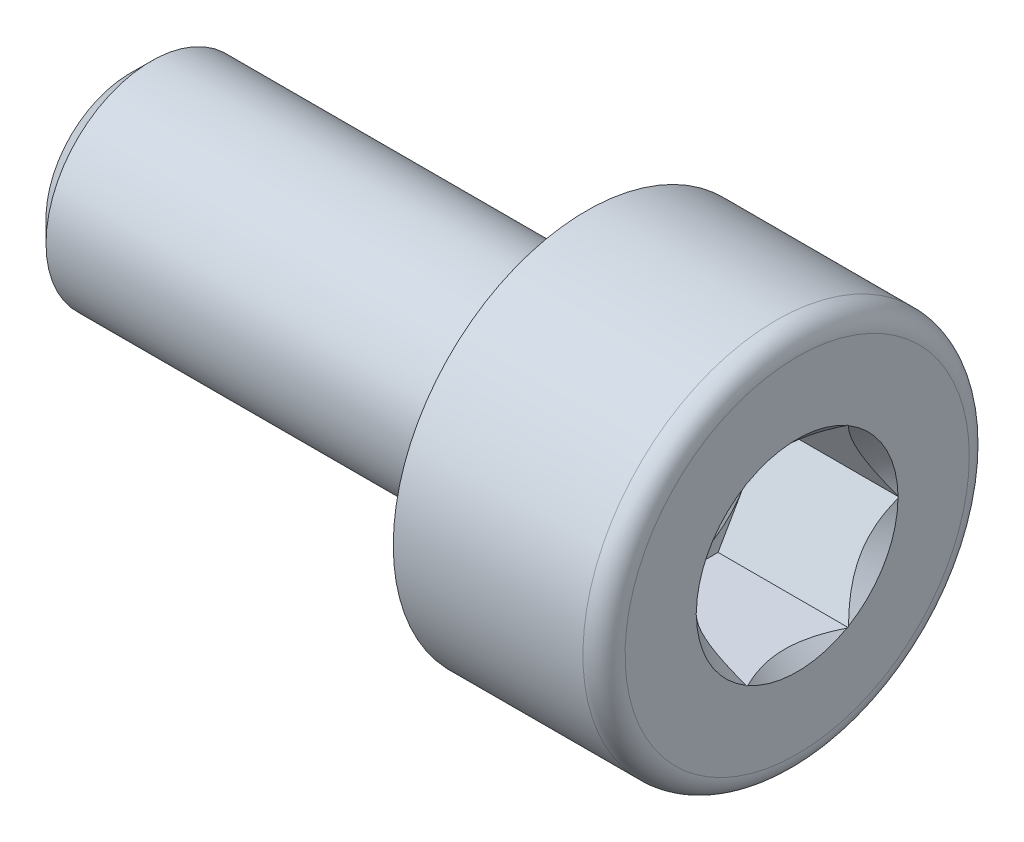
ISO-10303-21;
HEADER;
FILE_DESCRIPTION(('STEP AP214'),'2;1');
FILE_NAME('part.step','',(''),(''),'','','');
FILE_SCHEMA(('AUTOMOTIVE_DESIGN { 1 0 10303 214 1 1 1 1 }'));
ENDSEC;
DATA;
#1=APPLICATION_CONTEXT('core data for automotive mechanical design processes');
#2=APPLICATION_PROTOCOL_DEFINITION('international standard','automotive_design',2000,#1);
#3=PRODUCT_CONTEXT('',#1,'mechanical');
#4=PRODUCT('Part','Part','',(#3));
#5=PRODUCT_RELATED_PRODUCT_CATEGORY('part','',(#4));
#6=PRODUCT_DEFINITION_FORMATION('','',#4);
#7=PRODUCT_DEFINITION_CONTEXT('part definition',#1,'design');
#8=PRODUCT_DEFINITION('design','',#6,#7);
#9=PRODUCT_DEFINITION_SHAPE('','',#8);
#10=(LENGTH_UNIT() NAMED_UNIT(*) SI_UNIT(.MILLI.,.METRE.));
#11=(NAMED_UNIT(*) PLANE_ANGLE_UNIT() SI_UNIT($,.RADIAN.));
#12=(NAMED_UNIT(*) SI_UNIT($,.STERADIAN.) SOLID_ANGLE_UNIT());
#13=UNCERTAINTY_MEASURE_WITH_UNIT(LENGTH_MEASURE(1.E-05),#10,'distance_accuracy_value','');
#14=(GEOMETRIC_REPRESENTATION_CONTEXT(3) GLOBAL_UNCERTAINTY_ASSIGNED_CONTEXT((#13)) GLOBAL_UNIT_ASSIGNED_CONTEXT((#10,
#11,#12)) REPRESENTATION_CONTEXT('',''));
#15=CARTESIAN_POINT('',(0.,0.,0.));
#16=DIRECTION('',(0.,0.,1.));
#17=DIRECTION('',(1.,0.,0.));
#18=AXIS2_PLACEMENT_3D('',#15,#16,#17);
#19=CARTESIAN_POINT('',(12.3555753520445,407.524390512293,-362.357299098567));
#20=DIRECTION('',(-1.,0.,0.));
#21=DIRECTION('',(0.,0.,1.));
#22=AXIS2_PLACEMENT_3D('',#19,#20,#21);
#23=PLANE('',#22);
#24=DIRECTION('',(0.,0.001436357737234,-0.999998968437693));
#25=VECTOR('',#24,1.);
#26=CARTESIAN_POINT('',(12.3555753520447,406.275428403654,-363.08078163776));
#27=LINE('',#26,#25);
#28=CARTESIAN_POINT('',(12.3555753524192,406.274391801977,-362.359094545738));
#29=VERTEX_POINT('',#28);
#30=CARTESIAN_POINT('',(12.3555753520447,406.275428403654,-363.08078163776));
#31=VERTEX_POINT('',#30);
#32=EDGE_CURVE('E162',#29,#31,#27,.T.);
#33=ORIENTED_EDGE('',*,*,#32,.T.);
#34=DIRECTION('',(0.,0.866742689293892,-0.49875556192948));
#35=VECTOR('',#34,1.);
#36=CARTESIAN_POINT('',(12.3555753520447,407.526463716109,-363.800673282609));
#37=LINE('',#36,#35);
#38=CARTESIAN_POINT('',(12.3555753524191,406.900946059996,-363.440727459984));
#39=VERTEX_POINT('',#38);
#40=EDGE_CURVE('E158',#31,#39,#37,.T.);
#41=ORIENTED_EDGE('',*,*,#40,.T.);
#42=CARTESIAN_POINT('',(12.3555753527938,407.524390512293,-362.357299098567));
#43=DIRECTION('',(1.,0.,-2.1648728653482E-13));
#44=DIRECTION('',(-2.1648728653482E-13,0.,-1.));
#45=AXIS2_PLACEMENT_3D('',#42,#43,#44);
#46=CIRCLE('',#45,1.24999999953734);
#47=EDGE_CURVE('E159',#39,#29,#46,.F.);
#48=ORIENTED_EDGE('',*,*,#47,.T.);
#49=EDGE_LOOP('',(#33,#41,#48));
#50=FACE_BOUND('',#49,.T.);
#51=ADVANCED_FACE('F17',(#50),#23,.F.);
#52=CARTESIAN_POINT('',(12.3555753520445,407.524390512293,-362.357299098567));
#53=DIRECTION('',(-1.,0.,0.));
#54=DIRECTION('',(0.,0.,1.));
#55=AXIS2_PLACEMENT_3D('',#52,#53,#54);
#56=PLANE('',#55);
#57=DIRECTION('',(0.,-0.865306331556659,-0.501243406508213));
#58=VECTOR('',#57,1.);
#59=CARTESIAN_POINT('',(12.3555753520446,406.273355199838,-361.637407453717));
#60=LINE('',#59,#58);
#61=CARTESIAN_POINT('',(12.3555753524193,406.897836254274,-361.275666184321));
#62=VERTEX_POINT('',#61);
#63=CARTESIAN_POINT('',(12.3555753520446,406.273355199838,-361.637407453717));
#64=VERTEX_POINT('',#63);
#65=EDGE_CURVE('E526',#62,#64,#60,.T.);
#66=ORIENTED_EDGE('',*,*,#65,.T.);
#67=DIRECTION('',(0.,0.001436357737234,-0.999998968437693));
#68=VECTOR('',#67,1.);
#69=CARTESIAN_POINT('',(12.3555753520446,406.275428403654,-363.08078163776));
#70=LINE('',#69,#68);
#71=EDGE_CURVE('E554',#64,#29,#70,.T.);
#72=ORIENTED_EDGE('',*,*,#71,.T.);
#73=CARTESIAN_POINT('',(12.3555753527938,407.524390512293,-362.357299098567));
#74=DIRECTION('',(1.,0.,-2.1648728653482E-13));
#75=DIRECTION('',(-2.1648728653482E-13,0.,-1.));
#76=AXIS2_PLACEMENT_3D('',#73,#74,#75);
#77=CIRCLE('',#76,1.2499999995374);
#78=EDGE_CURVE('E177',#62,#29,#77,.T.);
#79=ORIENTED_EDGE('',*,*,#78,.F.);
#80=EDGE_LOOP('',(#66,#72,#79));
#81=FACE_BOUND('',#80,.T.);
#82=ADVANCED_FACE('F752',(#81),#56,.F.);
#83=CARTESIAN_POINT('',(12.3555753520447,406.275428403654,-363.08078163776));
#84=DIRECTION('',(0.,-0.999998968437693,-0.001436357737234));
#85=DIRECTION('',(0.,0.001436357737234,-0.999998968437693));
#86=AXIS2_PLACEMENT_3D('',#83,#84,#85);
#87=PLANE('',#86);
#88=DIRECTION('',(0.,0.001436357737234,-0.999998968437693));
#89=VECTOR('',#88,1.);
#90=CARTESIAN_POINT('',(14.2055753520446,406.275428403654,-363.08078163776));
#91=LINE('',#90,#89);
#92=CARTESIAN_POINT('',(14.2055753520446,406.275428403654,-363.08078163776));
#93=VERTEX_POINT('',#92);
#94=CARTESIAN_POINT('',(14.2055753520973,406.275404128297,-363.063881020518));
#95=VERTEX_POINT('',#94);
#96=EDGE_CURVE('E426',#93,#95,#91,.F.);
#97=ORIENTED_EDGE('',*,*,#96,.F.);
#98=DIRECTION('',(1.,0.,0.));
#99=VECTOR('',#98,1.);
#100=CARTESIAN_POINT('',(12.3555753520447,406.275428403654,-363.08078163776));
#101=LINE('',#100,#99);
#102=EDGE_CURVE('E167',#93,#31,#101,.F.);
#103=ORIENTED_EDGE('',*,*,#102,.T.);
#104=ORIENTED_EDGE('',*,*,#32,.F.);
#105=ORIENTED_EDGE('',*,*,#71,.F.);
#106=DIRECTION('',(1.,0.,0.));
#107=VECTOR('',#106,1.);
#108=CARTESIAN_POINT('',(12.3555753520446,406.273355199838,-361.637407453717));
#109=LINE('',#108,#107);
#110=CARTESIAN_POINT('',(14.2055753520446,406.273355199838,-361.637407453717));
#111=VERTEX_POINT('',#110);
#112=EDGE_CURVE('E516',#64,#111,#109,.T.);
#113=ORIENTED_EDGE('',*,*,#112,.T.);
#114=DIRECTION('',(0.,0.001436357737234,-0.999998968437693));
#115=VECTOR('',#114,1.);
#116=CARTESIAN_POINT('',(14.2055753520445,406.275428403654,-363.08078163776));
#117=LINE('',#116,#115);
#118=CARTESIAN_POINT('',(14.2055753521435,406.273379475196,-361.654308070866));
#119=VERTEX_POINT('',#118);
#120=EDGE_CURVE('E180',#119,#111,#117,.F.);
#121=ORIENTED_EDGE('',*,*,#120,.F.);
#122=CARTESIAN_POINT('',(14.2055753521289,406.275404128279,-363.063881020602));
#123=CARTESIAN_POINT('',(14.1818605667848,406.27533471834,-363.01555748896));
#124=CARTESIAN_POINT('',(14.159569883742,406.275264168751,-362.966440531812));
#125=CARTESIAN_POINT('',(14.1187835332008,406.275120364132,-362.866323081653));
#126=CARTESIAN_POINT('',(14.100311583221,406.275047095343,-362.815313009532));
#127=CARTESIAN_POINT('',(14.0684823412007,406.274898546402,-362.711892543476));
#128=CARTESIAN_POINT('',(14.0551059144007,406.274823274934,-362.659488195058));
#129=CARTESIAN_POINT('',(14.0345556307389,406.274671155289,-362.553581787525));
#130=CARTESIAN_POINT('',(14.027363591714,406.27459431242,-362.500083422933));
#131=CARTESIAN_POINT('',(14.0226061400704,406.274496306429,-362.431851194154));
#132=CARTESIAN_POINT('',(14.0218454535466,406.27447541587,-362.417307089476));
#133=CARTESIAN_POINT('',(14.0208299372629,406.274433618425,-362.388207513194));
#134=CARTESIAN_POINT('',(14.0205748780474,406.274412711551,-362.373652049746));
#135=CARTESIAN_POINT('',(14.0205765865692,406.274337309511,-362.321156797229));
#136=CARTESIAN_POINT('',(14.022313287963,406.274282797371,-362.283205190141));
#137=CARTESIAN_POINT('',(14.029156995847,406.274174198452,-362.207598115691));
#138=CARTESIAN_POINT('',(14.0342663783373,406.274120112002,-362.169942876053));
#139=CARTESIAN_POINT('',(14.0543308196241,406.273958596293,-362.057494884655));
#140=CARTESIAN_POINT('',(14.0740189447633,406.273852342445,-361.983520459123));
#141=CARTESIAN_POINT('',(14.1132845540875,406.273685025343,-361.867033510921));
#142=CARTESIAN_POINT('',(14.129937513991,406.273622432678,-361.823456205249));
#143=CARTESIAN_POINT('',(14.1659144313925,406.273499472257,-361.737850585708));
#144=CARTESIAN_POINT('',(14.185214236532,406.273439090016,-361.695812186982));
#145=CARTESIAN_POINT('',(14.2055753521374,406.273379475196,-361.654308070878));
#146=B_SPLINE_CURVE_WITH_KNOTS('',3,(#122,#123,#124,#125,#126,#127,#128,#129,#130,#131,#132,
#133,#134,#135,#136,#137,#138,#139,#140,#141,#142,#143,#144,#145),.UNSPECIFIED.,.F.,.F.,(4,2,2,
2,2,2,2,2,2,2,2,4),(0.,0.161592976200705,0.324161275185263,0.486112932506154,0.64758680624857,
0.691272786581087,0.734938937498539,0.848735605594725,0.962612527312217,1.1912562519349,
1.33113310613993,1.46980937849091),.UNSPECIFIED.);
#147=EDGE_CURVE('E421',#95,#119,#146,.T.);
#148=ORIENTED_EDGE('',*,*,#147,.F.);
#149=EDGE_LOOP('',(#97,#103,#104,#105,#113,#121,#148));
#150=FACE_BOUND('',#149,.T.);
#151=ADVANCED_FACE('F412',(#150),#87,.F.);
#152=CARTESIAN_POINT('',(12.3555753520447,407.526463716109,-363.800673282609));
#153=DIRECTION('',(0.,-0.49875556192948,-0.866742689293892));
#154=DIRECTION('',(0.,0.866742689293892,-0.49875556192948));
#155=AXIS2_PLACEMENT_3D('',#152,#153,#154);
#156=PLANE('',#155);
#157=DIRECTION('',(1.,0.,0.));
#158=VECTOR('',#157,1.);
#159=CARTESIAN_POINT('',(12.3555753520446,407.526463716109,-363.800673282609));
#160=LINE('',#159,#158);
#161=CARTESIAN_POINT('',(14.2055753520446,407.526463716109,-363.800673282609));
#162=VERTEX_POINT('',#161);
#163=CARTESIAN_POINT('',(12.3555753520446,407.526463716109,-363.800673282609));
#164=VERTEX_POINT('',#163);
#165=EDGE_CURVE('E172',#162,#164,#160,.F.);
#166=ORIENTED_EDGE('',*,*,#165,.T.);
#167=DIRECTION('',(0.,-0.866742689293953,0.498755561929374));
#168=VECTOR('',#167,1.);
#169=CARTESIAN_POINT('',(12.3555753520445,407.526463716109,-363.800673282609));
#170=LINE('',#169,#168);
#171=EDGE_CURVE('E146',#164,#39,#170,.T.);
#172=ORIENTED_EDGE('',*,*,#171,.T.);
#173=ORIENTED_EDGE('',*,*,#40,.F.);
#174=ORIENTED_EDGE('',*,*,#102,.F.);
#175=DIRECTION('',(0.,0.866742689293892,-0.49875556192948));
#176=VECTOR('',#175,1.);
#177=CARTESIAN_POINT('',(14.2055753520446,407.526463716109,-363.800673282609));
#178=LINE('',#177,#176);
#179=CARTESIAN_POINT('',(14.2055753521434,406.290076905122,-363.089210923257));
#180=VERTEX_POINT('',#179);
#181=EDGE_CURVE('E420',#180,#93,#178,.F.);
#182=ORIENTED_EDGE('',*,*,#181,.F.);
#183=CARTESIAN_POINT('',(14.2055753521287,407.511815214623,-363.792243997122));
#184=CARTESIAN_POINT('',(14.1818605667839,407.46993110365,-363.76814234207));
#185=CARTESIAN_POINT('',(14.1595698837407,407.427359296207,-363.743644961233));
#186=CARTESIAN_POINT('',(14.1187835331992,407.340583138697,-363.693710774605));
#187=CARTESIAN_POINT('',(14.1003115832193,407.296370485996,-363.668269191176));
#188=CARTESIAN_POINT('',(14.0684823411992,407.20673146065,-363.616687605306));
#189=CARTESIAN_POINT('',(14.0551059143994,407.161310327918,-363.590550618102));
#190=CARTESIAN_POINT('',(14.0345556307389,407.069516628751,-363.537729153811));
#191=CARTESIAN_POINT('',(14.0273635917152,407.023147264521,-363.51104651939));
#192=CARTESIAN_POINT('',(14.0226061400698,406.964007418044,-363.477015280683));
#193=CARTESIAN_POINT('',(14.0218454535455,406.951401408638,-363.469761320099));
#194=CARTESIAN_POINT('',(14.0208299372636,406.926179537618,-363.455247729603));
#195=CARTESIAN_POINT('',(14.0205748780505,406.913563683074,-363.447988103759));
#196=CARTESIAN_POINT('',(14.0205765865764,406.8680637598,-363.421805777573));
#197=CARTESIAN_POINT('',(14.0223132879649,406.835169447871,-363.402877182939));
#198=CARTESIAN_POINT('',(14.0291569958448,406.769637501227,-363.365167695145));
#199=CARTESIAN_POINT('',(14.0342663783365,406.737000063892,-363.346386915563));
#200=CARTESIAN_POINT('',(14.0543308196254,406.639536488885,-363.290302796567));
#201=CARTESIAN_POINT('',(14.0740189447635,406.575419630219,-363.253407602335));
#202=CARTESIAN_POINT('',(14.113284554087,406.474455315315,-363.195309029096));
#203=CARTESIAN_POINT('',(14.1299375139905,406.436684965243,-363.173574583098));
#204=CARTESIAN_POINT('',(14.1659144313923,406.362486843802,-363.130878260175));
#205=CARTESIAN_POINT('',(14.1852142365321,406.32605033145,-363.109911353366));
#206=CARTESIAN_POINT('',(14.2055753521375,406.290076905133,-363.089210923263));
#207=B_SPLINE_CURVE_WITH_KNOTS('',3,(#183,#184,#185,#186,#187,#188,#189,#190,#191,#192,#193,
#194,#195,#196,#197,#198,#199,#200,#201,#202,#203,#204,#205,#206),.UNSPECIFIED.,.F.,.F.,(4,2,2,
2,2,2,2,2,2,2,2,4),(0.,0.161592976203974,0.324161275190541,0.486112932508355,0.647586806248283,
0.691272786580778,0.734938937498177,0.848735605595208,0.962612527312501,1.19125625193406,
1.33113310613897,1.46980937849126),.UNSPECIFIED.);
#208=CARTESIAN_POINT('',(14.2055753520972,407.511815214559,-363.792243997064));
#209=VERTEX_POINT('',#208);
#210=EDGE_CURVE('E415',#209,#180,#207,.T.);
#211=ORIENTED_EDGE('',*,*,#210,.F.);
#212=DIRECTION('',(0.,0.866742689293892,-0.49875556192948));
#213=VECTOR('',#212,1.);
#214=CARTESIAN_POINT('',(14.2055753520445,407.526463716109,-363.800673282609));
#215=LINE('',#214,#213);
#216=EDGE_CURVE('E166',#162,#209,#215,.F.);
#217=ORIENTED_EDGE('',*,*,#216,.F.);
#218=EDGE_LOOP('',(#166,#172,#173,#174,#182,#211,#217));
#219=FACE_BOUND('',#218,.T.);
#220=ADVANCED_FACE('F169',(#219),#156,.F.);
#221=CARTESIAN_POINT('',(12.3555753520445,407.524390512293,-362.357299098567));
#222=DIRECTION('',(-1.,0.,0.));
#223=DIRECTION('',(0.,0.,1.));
#224=AXIS2_PLACEMENT_3D('',#221,#222,#223);
#225=PLANE('',#224);
#226=ORIENTED_EDGE('',*,*,#171,.F.);
#227=DIRECTION('',(0.,0.865306331556659,0.501243406508213));
#228=VECTOR('',#227,1.);
#229=CARTESIAN_POINT('',(12.3555753520447,408.775425824748,-363.077190743417));
#230=LINE('',#229,#228);
#231=CARTESIAN_POINT('',(12.3555753524191,408.150944770312,-363.438932012813));
#232=VERTEX_POINT('',#231);
#233=EDGE_CURVE('E148',#164,#232,#230,.T.);
#234=ORIENTED_EDGE('',*,*,#233,.T.);
#235=CARTESIAN_POINT('',(12.3555753527938,407.524390512293,-362.357299098567));
#236=DIRECTION('',(1.,0.,-2.1648728653482E-13));
#237=DIRECTION('',(-2.1648728653482E-13,0.,-1.));
#238=AXIS2_PLACEMENT_3D('',#235,#236,#237);
#239=CIRCLE('',#238,1.24999999953735);
#240=EDGE_CURVE('E142',#232,#39,#239,.F.);
#241=ORIENTED_EDGE('',*,*,#240,.T.);
#242=EDGE_LOOP('',(#226,#234,#241));
#243=FACE_BOUND('',#242,.T.);
#244=ADVANCED_FACE('F144',(#243),#225,.F.);
#245=CARTESIAN_POINT('',(12.3555753527282,407.524390512293,-362.357299098567));
#246=DIRECTION('',(1.,0.,-2.1648728653482E-13));
#247=DIRECTION('',(-2.1648728653482E-13,0.,-1.));
#248=AXIS2_PLACEMENT_3D('',#245,#246,#247);
#249=CONICAL_SURFACE('',#248,1.24999999942377,1.04719754973717);
#250=CARTESIAN_POINT('',(12.3555753527938,407.524390512293,-362.357299098567));
#251=DIRECTION('',(1.,0.,-2.1648728653482E-13));
#252=DIRECTION('',(-2.1648728653482E-13,0.,-1.));
#253=AXIS2_PLACEMENT_3D('',#250,#251,#252);
#254=CIRCLE('',#253,1.24999999953746);
#255=CARTESIAN_POINT('',(12.3555753524193,408.147834964589,-361.27387073715));
#256=VERTEX_POINT('',#255);
#257=EDGE_CURVE('E153',#256,#62,#254,.T.);
#258=ORIENTED_EDGE('',*,*,#257,.T.);
#259=ORIENTED_EDGE('',*,*,#78,.T.);
#260=ORIENTED_EDGE('',*,*,#47,.F.);
#261=ORIENTED_EDGE('',*,*,#240,.F.);
#262=CARTESIAN_POINT('',(12.3555753527938,407.524390512293,-362.357299098567));
#263=DIRECTION('',(1.,0.,-2.1648728653482E-13));
#264=DIRECTION('',(-2.1648728653482E-13,0.,-1.));
#265=AXIS2_PLACEMENT_3D('',#262,#263,#264);
#266=CIRCLE('',#265,1.2499999995374);
#267=CARTESIAN_POINT('',(12.3555753524192,408.774389222609,-362.355503651395));
#268=VERTEX_POINT('',#267);
#269=EDGE_CURVE('E380',#232,#268,#266,.T.);
#270=ORIENTED_EDGE('',*,*,#269,.T.);
#271=CARTESIAN_POINT('',(12.3555753527938,407.524390512293,-362.357299098567));
#272=DIRECTION('',(1.,0.,-2.1648728653482E-13));
#273=DIRECTION('',(-2.1648728653482E-13,0.,-1.));
#274=AXIS2_PLACEMENT_3D('',#271,#272,#273);
#275=CIRCLE('',#274,1.24999999953748);
#276=EDGE_CURVE('E789',#268,#256,#275,.T.);
#277=ORIENTED_EDGE('',*,*,#276,.T.);
#278=EDGE_LOOP('',(#258,#259,#260,#261,#270,#277));
#279=FACE_BOUND('',#278,.T.);
#280=CARTESIAN_POINT('',(11.633887514364,407.524390512293,-362.357299098624));
#281=VERTEX_POINT('',#280);
#282=VERTEX_LOOP('',#281);
#283=FACE_BOUND('',#282,.T.);
#284=ADVANCED_FACE('F174',(#279,#283),#249,.F.);
#285=CARTESIAN_POINT('',(12.3555753520445,407.524390512293,-362.357299098567));
#286=DIRECTION('',(-1.,0.,0.));
#287=DIRECTION('',(0.,0.,1.));
#288=AXIS2_PLACEMENT_3D('',#285,#286,#287);
#289=PLANE('',#288);
#290=DIRECTION('',(0.,-0.866742689293892,0.49875556192948));
#291=VECTOR('',#290,1.);
#292=CARTESIAN_POINT('',(12.3555753520445,407.522317308477,-360.913924914525));
#293=LINE('',#292,#291);
#294=CARTESIAN_POINT('',(12.3555753520445,407.522317308477,-360.913924914525));
#295=VERTEX_POINT('',#294);
#296=EDGE_CURVE('E511',#256,#295,#293,.T.);
#297=ORIENTED_EDGE('',*,*,#296,.T.);
#298=DIRECTION('',(0.,-0.865306331556659,-0.501243406508213));
#299=VECTOR('',#298,1.);
#300=CARTESIAN_POINT('',(12.3555753520446,406.273355199838,-361.637407453717));
#301=LINE('',#300,#299);
#302=EDGE_CURVE('E521',#295,#62,#301,.T.);
#303=ORIENTED_EDGE('',*,*,#302,.T.);
#304=ORIENTED_EDGE('',*,*,#257,.F.);
#305=EDGE_LOOP('',(#297,#303,#304));
#306=FACE_BOUND('',#305,.T.);
#307=ADVANCED_FACE('F400',(#306),#289,.F.);
#308=CARTESIAN_POINT('',(12.3555753520446,406.273355199838,-361.637407453717));
#309=DIRECTION('',(0.,-0.501243406508213,0.865306331556659));
#310=DIRECTION('',(0.,-0.865306331556659,-0.501243406508213));
#311=AXIS2_PLACEMENT_3D('',#308,#309,#310);
#312=PLANE('',#311);
#313=ORIENTED_EDGE('',*,*,#112,.F.);
#314=ORIENTED_EDGE('',*,*,#65,.F.);
#315=ORIENTED_EDGE('',*,*,#302,.F.);
#316=DIRECTION('',(1.,0.,0.));
#317=VECTOR('',#316,1.);
#318=CARTESIAN_POINT('',(12.3555753520446,407.522317308477,-360.913924914525));
#319=LINE('',#318,#317);
#320=CARTESIAN_POINT('',(14.2055753520446,407.522317308477,-360.913924914525));
#321=VERTEX_POINT('',#320);
#322=EDGE_CURVE('E507',#295,#321,#319,.T.);
#323=ORIENTED_EDGE('',*,*,#322,.T.);
#324=DIRECTION('',(0.,-0.865306331556659,-0.501243406508213));
#325=VECTOR('',#324,1.);
#326=CARTESIAN_POINT('',(14.2055753520446,406.273355199838,-361.637407453717));
#327=LINE('',#326,#325);
#328=CARTESIAN_POINT('',(14.205575352144,407.507693082365,-360.922396246175));
#329=VERTEX_POINT('',#328);
#330=EDGE_CURVE('E519',#329,#321,#327,.F.);
#331=ORIENTED_EDGE('',*,*,#330,.F.);
#332=CARTESIAN_POINT('',(14.2055753521297,406.287979425948,-361.628936122046));
#333=CARTESIAN_POINT('',(14.181860566785,406.329794126983,-361.604714245454));
#334=CARTESIAN_POINT('',(14.1595698837418,406.372295384836,-361.580094669143));
#335=CARTESIAN_POINT('',(14.1187835332003,406.458927737727,-361.52991140561));
#336=CARTESIAN_POINT('',(14.1003115832204,406.50306712164,-361.504342916917));
#337=CARTESIAN_POINT('',(14.0684823412004,406.592557598044,-361.452504036732));
#338=CARTESIAN_POINT('',(14.0551059144005,406.637903459308,-361.426236675519));
#339=CARTESIAN_POINT('',(14.0345556307401,406.729545038832,-361.373151732279));
#340=CARTESIAN_POINT('',(14.0273635917164,406.775837560195,-361.346336002108));
#341=CARTESIAN_POINT('',(14.0226061400711,406.834879400676,-361.312135012038));
#342=CARTESIAN_POINT('',(14.0218454535467,406.847464519523,-361.304844867943));
#343=CARTESIAN_POINT('',(14.0208299372649,406.872644593102,-361.290258882157));
#344=CARTESIAN_POINT('',(14.0205748780517,406.885239540778,-361.282963044554));
#345=CARTESIAN_POINT('',(14.0205765865776,406.930664062021,-361.256650118221));
#346=CARTESIAN_POINT('',(14.0223132879661,406.963503861797,-361.237627105768));
#347=CARTESIAN_POINT('',(14.0291569958461,407.028927209513,-361.199729519112));
#348=CARTESIAN_POINT('',(14.0342663783377,407.061510560401,-361.180855059055));
#349=CARTESIAN_POINT('',(14.0543308196266,407.158812619704,-361.124491186654));
#350=CARTESIAN_POINT('',(14.0740189447647,407.222823224519,-361.087411955354));
#351=CARTESIAN_POINT('',(14.1132845540882,407.32362022232,-361.029023580392));
#352=CARTESIAN_POINT('',(14.1299375139917,407.361327979727,-361.007180720718));
#353=CARTESIAN_POINT('',(14.1659144313932,407.435403140747,-360.9642714241));
#354=CARTESIAN_POINT('',(14.1852142365329,407.471779270858,-360.943199932181));
#355=CARTESIAN_POINT('',(14.2055753521382,407.507693082355,-360.922396246181));
#356=B_SPLINE_CURVE_WITH_KNOTS('',3,(#332,#333,#334,#335,#336,#337,#338,#339,#340,#341,#342,
#343,#344,#345,#346,#347,#348,#349,#350,#351,#352,#353,#354,#355),.UNSPECIFIED.,.F.,.F.,(4,2,2,
2,2,2,2,2,2,2,2,4),(0.,0.161592976203827,0.324161275190308,0.486112932508081,0.647586806247845,
0.69127278658043,0.734938937497821,0.84873560559484,0.962612527312168,1.1912562519338,
1.33113310613816,1.46980937848977),.UNSPECIFIED.);
#357=CARTESIAN_POINT('',(14.2055753520975,406.287979426032,-361.628936122019));
#358=VERTEX_POINT('',#357);
#359=EDGE_CURVE('E381',#358,#329,#356,.T.);
#360=ORIENTED_EDGE('',*,*,#359,.F.);
#361=DIRECTION('',(0.,-0.865306331556659,-0.501243406508213));
#362=VECTOR('',#361,1.);
#363=CARTESIAN_POINT('',(14.2055753520446,406.273355199838,-361.637407453717));
#364=LINE('',#363,#362);
#365=EDGE_CURVE('E379',#111,#358,#364,.F.);
#366=ORIENTED_EDGE('',*,*,#365,.F.);
#367=EDGE_LOOP('',(#313,#314,#315,#323,#331,#360,#366));
#368=FACE_BOUND('',#367,.T.);
#369=ADVANCED_FACE('F394',(#368),#312,.F.);
#370=CARTESIAN_POINT('',(12.3555753520446,408.775425824748,-363.077190743417));
#371=DIRECTION('',(0.,0.501243406508213,-0.865306331556659));
#372=DIRECTION('',(0.,0.865306331556659,0.501243406508213));
#373=AXIS2_PLACEMENT_3D('',#370,#371,#372);
#374=PLANE('',#373);
#375=DIRECTION('',(1.,0.,0.));
#376=VECTOR('',#375,1.);
#377=CARTESIAN_POINT('',(12.3555753520445,408.775425824748,-363.077190743417));
#378=LINE('',#377,#376);
#379=CARTESIAN_POINT('',(14.2055753520445,408.775425824748,-363.077190743417));
#380=VERTEX_POINT('',#379);
#381=CARTESIAN_POINT('',(12.3555753520446,408.775425824748,-363.077190743417));
#382=VERTEX_POINT('',#381);
#383=EDGE_CURVE('E798',#380,#382,#378,.F.);
#384=ORIENTED_EDGE('',*,*,#383,.T.);
#385=DIRECTION('',(0.,-0.865306331556971,-0.501243406507673));
#386=VECTOR('',#385,1.);
#387=CARTESIAN_POINT('',(12.3555753520445,408.775425824748,-363.077190743417));
#388=LINE('',#387,#386);
#389=EDGE_CURVE('E819',#382,#232,#388,.T.);
#390=ORIENTED_EDGE('',*,*,#389,.T.);
#391=ORIENTED_EDGE('',*,*,#233,.F.);
#392=ORIENTED_EDGE('',*,*,#165,.F.);
#393=DIRECTION('',(0.,0.865306331556659,0.501243406508213));
#394=VECTOR('',#393,1.);
#395=CARTESIAN_POINT('',(14.2055753520446,408.775425824748,-363.077190743417));
#396=LINE('',#395,#394);
#397=CARTESIAN_POINT('',(14.2055753521435,407.541087942221,-363.792201950959));
#398=VERTEX_POINT('',#397);
#399=EDGE_CURVE('E378',#398,#162,#396,.F.);
#400=ORIENTED_EDGE('',*,*,#399,.F.);
#401=CARTESIAN_POINT('',(14.2055753521294,408.760801598638,-363.085662075088));
#402=CARTESIAN_POINT('',(14.1818605667847,408.718986897603,-363.10988395168));
#403=CARTESIAN_POINT('',(14.1595698837415,408.67648563975,-363.134503527991));
#404=CARTESIAN_POINT('',(14.1187835332,408.589853286859,-363.184686791524));
#405=CARTESIAN_POINT('',(14.1003115832201,408.545713902946,-363.210255280217));
#406=CARTESIAN_POINT('',(14.0684823412001,408.456223426542,-363.262094160402));
#407=CARTESIAN_POINT('',(14.0551059144002,408.410877565278,-363.288361521615));
#408=CARTESIAN_POINT('',(14.0345556307397,408.319235985754,-363.341446464855));
#409=CARTESIAN_POINT('',(14.027363591716,408.272943464391,-363.368262195026));
#410=CARTESIAN_POINT('',(14.0226061400707,408.21390162391,-363.402463185096));
#411=CARTESIAN_POINT('',(14.0218454535463,408.201316505063,-363.409753329191));
#412=CARTESIAN_POINT('',(14.0208299372644,408.176136431484,-363.424339314977));
#413=CARTESIAN_POINT('',(14.0205748780513,408.163541483808,-363.43163515258));
#414=CARTESIAN_POINT('',(14.0205765865772,408.118116962565,-363.457948078913));
#415=CARTESIAN_POINT('',(14.0223132879656,408.085277162789,-363.476971091367));
#416=CARTESIAN_POINT('',(14.0291569958456,408.019853815073,-363.514868678022));
#417=CARTESIAN_POINT('',(14.0342663783373,407.987270464185,-363.533743138079));
#418=CARTESIAN_POINT('',(14.0543308196262,407.889968404882,-363.59010701048));
#419=CARTESIAN_POINT('',(14.0740189447642,407.825957800067,-363.62718624178));
#420=CARTESIAN_POINT('',(14.1132845540877,407.725160802266,-363.685574616743));
#421=CARTESIAN_POINT('',(14.1299375139911,407.687453044858,-363.707417476416));
#422=CARTESIAN_POINT('',(14.1659144313927,407.613377883839,-363.750326773035));
#423=CARTESIAN_POINT('',(14.1852142365324,407.577001753728,-363.771398264953));
#424=CARTESIAN_POINT('',(14.2055753521377,407.541087942231,-363.792201950953));
#425=B_SPLINE_CURVE_WITH_KNOTS('',3,(#401,#402,#403,#404,#405,#406,#407,#408,#409,#410,#411,
#412,#413,#414,#415,#416,#417,#418,#419,#420,#421,#422,#423,#424),.UNSPECIFIED.,.F.,.F.,(4,2,2,
2,2,2,2,2,2,2,2,4),(0.,0.161592976203841,0.324161275190408,0.486112932508261,0.647586806248027,
0.691272786580509,0.734938937497852,0.848735605595021,0.962612527312319,1.19125625193397,
1.33113310613841,1.4698093784901),.UNSPECIFIED.);
#426=CARTESIAN_POINT('',(14.2055753520972,408.760801598554,-363.085662075115));
#427=VERTEX_POINT('',#426);
#428=EDGE_CURVE('E370',#427,#398,#425,.T.);
#429=ORIENTED_EDGE('',*,*,#428,.F.);
#430=DIRECTION('',(0.,0.865306331556659,0.501243406508213));
#431=VECTOR('',#430,1.);
#432=CARTESIAN_POINT('',(14.2055753520445,408.775425824748,-363.077190743417));
#433=LINE('',#432,#431);
#434=EDGE_CURVE('E498',#380,#427,#433,.F.);
#435=ORIENTED_EDGE('',*,*,#434,.F.);
#436=EDGE_LOOP('',(#384,#390,#391,#392,#400,#429,#435));
#437=FACE_BOUND('',#436,.T.);
#438=ADVANCED_FACE('F389',(#437),#374,.F.);
#439=CARTESIAN_POINT('',(12.3555753520445,407.524390512293,-362.357299098567));
#440=DIRECTION('',(-1.,0.,0.));
#441=DIRECTION('',(0.,0.,1.));
#442=AXIS2_PLACEMENT_3D('',#439,#440,#441);
#443=PLANE('',#442);
#444=ORIENTED_EDGE('',*,*,#389,.F.);
#445=DIRECTION('',(0.,-0.001436357737234,0.999998968437693));
#446=VECTOR('',#445,1.);
#447=CARTESIAN_POINT('',(12.3555753520446,408.773352620932,-361.633816559374));
#448=LINE('',#447,#446);
#449=EDGE_CURVE('E812',#382,#268,#448,.T.);
#450=ORIENTED_EDGE('',*,*,#449,.T.);
#451=ORIENTED_EDGE('',*,*,#269,.F.);
#452=EDGE_LOOP('',(#444,#450,#451));
#453=FACE_BOUND('',#452,.T.);
#454=ADVANCED_FACE('F393',(#453),#443,.F.);
#455=CARTESIAN_POINT('',(12.3555753520445,407.524390512293,-362.357299098567));
#456=DIRECTION('',(-1.,0.,0.));
#457=DIRECTION('',(0.,0.,1.));
#458=AXIS2_PLACEMENT_3D('',#455,#456,#457);
#459=PLANE('',#458);
#460=DIRECTION('',(0.,-0.001436357737234,0.999998968437693));
#461=VECTOR('',#460,1.);
#462=CARTESIAN_POINT('',(12.3555753520445,408.773352620932,-361.633816559374));
#463=LINE('',#462,#461);
#464=CARTESIAN_POINT('',(12.3555753520445,408.773352620932,-361.633816559374));
#465=VERTEX_POINT('',#464);
#466=EDGE_CURVE('E337',#268,#465,#463,.T.);
#467=ORIENTED_EDGE('',*,*,#466,.T.);
#468=DIRECTION('',(0.,-0.866742689293892,0.49875556192948));
#469=VECTOR('',#468,1.);
#470=CARTESIAN_POINT('',(12.3555753520445,407.522317308477,-360.913924914525));
#471=LINE('',#470,#469);
#472=EDGE_CURVE('E530',#465,#256,#471,.T.);
#473=ORIENTED_EDGE('',*,*,#472,.T.);
#474=ORIENTED_EDGE('',*,*,#276,.F.);
#475=EDGE_LOOP('',(#467,#473,#474));
#476=FACE_BOUND('',#475,.T.);
#477=ADVANCED_FACE('F700',(#476),#459,.F.);
#478=CARTESIAN_POINT('',(12.3555753520446,407.522317308477,-360.913924914525));
#479=DIRECTION('',(0.,0.49875556192948,0.866742689293892));
#480=DIRECTION('',(0.,-0.866742689293892,0.49875556192948));
#481=AXIS2_PLACEMENT_3D('',#478,#479,#480);
#482=PLANE('',#481);
#483=ORIENTED_EDGE('',*,*,#322,.F.);
#484=ORIENTED_EDGE('',*,*,#296,.F.);
#485=ORIENTED_EDGE('',*,*,#472,.F.);
#486=DIRECTION('',(1.,0.,0.));
#487=VECTOR('',#486,1.);
#488=CARTESIAN_POINT('',(12.3555753520445,408.773352620932,-361.633816559374));
#489=LINE('',#488,#487);
#490=CARTESIAN_POINT('',(14.2055753520445,408.773352620932,-361.633816559374));
#491=VERTEX_POINT('',#490);
#492=EDGE_CURVE('E331',#465,#491,#489,.T.);
#493=ORIENTED_EDGE('',*,*,#492,.T.);
#494=DIRECTION('',(0.,-0.866742689293892,0.49875556192948));
#495=VECTOR('',#494,1.);
#496=CARTESIAN_POINT('',(14.2055753520444,407.522317308477,-360.913924914525));
#497=LINE('',#496,#495);
#498=CARTESIAN_POINT('',(14.2055753521437,408.758704119464,-361.625387273877));
#499=VERTEX_POINT('',#498);
#500=EDGE_CURVE('E804',#499,#491,#497,.F.);
#501=ORIENTED_EDGE('',*,*,#500,.F.);
#502=CARTESIAN_POINT('',(14.2055753521292,407.536965809963,-360.922354200012));
#503=CARTESIAN_POINT('',(14.1818605667845,407.578849920937,-360.946455855064));
#504=CARTESIAN_POINT('',(14.1595698837413,407.621421728379,-360.970953235902));
#505=CARTESIAN_POINT('',(14.1187835331997,407.708197885889,-361.020887422529));
#506=CARTESIAN_POINT('',(14.1003115832198,407.75241053859,-361.046329005958));
#507=CARTESIAN_POINT('',(14.0684823411998,407.842049563936,-361.097910591829));
#508=CARTESIAN_POINT('',(14.0551059143999,407.887470696668,-361.124047579033));
#509=CARTESIAN_POINT('',(14.0345556307394,407.979264395835,-361.176869043323));
#510=CARTESIAN_POINT('',(14.0273635917157,408.025633760065,-361.203551677744));
#511=CARTESIAN_POINT('',(14.0226061400704,408.084773606542,-361.237582916451));
#512=CARTESIAN_POINT('',(14.021845453546,408.097379615948,-361.244836877035));
#513=CARTESIAN_POINT('',(14.0208299372641,408.122601486968,-361.259350467531));
#514=CARTESIAN_POINT('',(14.0205748780509,408.135217341512,-361.266610093375));
#515=CARTESIAN_POINT('',(14.0205765865768,408.180717264785,-361.29279241956));
#516=CARTESIAN_POINT('',(14.0223132879653,408.213611576714,-361.311721014195));
#517=CARTESIAN_POINT('',(14.0291569958452,408.279143523358,-361.349430501989));
#518=CARTESIAN_POINT('',(14.0342663783368,408.311780960694,-361.368211281571));
#519=CARTESIAN_POINT('',(14.0543308196257,408.409244535701,-361.424295400567));
#520=CARTESIAN_POINT('',(14.0740189447637,408.473361394367,-361.461190594798));
#521=CARTESIAN_POINT('',(14.1132845540871,408.57432570927,-361.519289168037));
#522=CARTESIAN_POINT('',(14.1299375139907,408.612096059343,-361.541023614036));
#523=CARTESIAN_POINT('',(14.1659144313924,408.686294180783,-361.583719936959));
#524=CARTESIAN_POINT('',(14.1852142365322,408.722730693135,-361.604686843767));
#525=CARTESIAN_POINT('',(14.2055753521376,408.758704119453,-361.62538727387));
#526=B_SPLINE_CURVE_WITH_KNOTS('',3,(#502,#503,#504,#505,#506,#507,#508,#509,#510,#511,#512,
#513,#514,#515,#516,#517,#518,#519,#520,#521,#522,#523,#524,#525),.UNSPECIFIED.,.F.,.F.,(4,2,2,
2,2,2,2,2,2,2,2,4),(0.,0.161592976203936,0.324161275190437,0.486112932508307,0.647586806248113,
0.691272786580284,0.734938937497333,0.848735605594266,0.962612527311499,1.19125625193286,
1.33113310613795,1.4698093784903),.UNSPECIFIED.);
#527=CARTESIAN_POINT('',(14.2055753520974,407.536965810028,-360.92235420007));
#528=VERTEX_POINT('',#527);
#529=EDGE_CURVE('E347',#528,#499,#526,.T.);
#530=ORIENTED_EDGE('',*,*,#529,.F.);
#531=DIRECTION('',(0.,-0.866742689293892,0.49875556192948));
#532=VECTOR('',#531,1.);
#533=CARTESIAN_POINT('',(14.2055753520445,407.522317308477,-360.913924914525));
#534=LINE('',#533,#532);
#535=EDGE_CURVE('E510',#321,#528,#534,.F.);
#536=ORIENTED_EDGE('',*,*,#535,.F.);
#537=EDGE_LOOP('',(#483,#484,#485,#493,#501,#530,#536));
#538=FACE_BOUND('',#537,.T.);
#539=ADVANCED_FACE('F693',(#538),#482,.F.);
#540=CARTESIAN_POINT('',(12.3555753520445,408.773352620932,-361.633816559374));
#541=DIRECTION('',(0.,0.999998968437693,0.001436357737234));
#542=DIRECTION('',(0.,-0.001436357737234,0.999998968437693));
#543=AXIS2_PLACEMENT_3D('',#540,#541,#542);
#544=PLANE('',#543);
#545=ORIENTED_EDGE('',*,*,#492,.F.);
#546=ORIENTED_EDGE('',*,*,#466,.F.);
#547=ORIENTED_EDGE('',*,*,#449,.F.);
#548=ORIENTED_EDGE('',*,*,#383,.F.);
#549=DIRECTION('',(0.,-0.001436357737234,0.999998968437693));
#550=VECTOR('',#549,1.);
#551=CARTESIAN_POINT('',(14.2055753520445,408.773352620932,-361.633816559374));
#552=LINE('',#551,#550);
#553=CARTESIAN_POINT('',(14.2055753520973,408.77540154939,-363.060290126174));
#554=VERTEX_POINT('',#553);
#555=EDGE_CURVE('E796',#554,#380,#552,.F.);
#556=ORIENTED_EDGE('',*,*,#555,.F.);
#557=CARTESIAN_POINT('',(14.205575352131,408.775401549413,-363.060290126268));
#558=CARTESIAN_POINT('',(14.1818605667876,408.775332139448,-363.011966594624));
#559=CARTESIAN_POINT('',(14.1595698837449,408.775261589848,-362.962849637476));
#560=CARTESIAN_POINT('',(14.1187835332032,408.775117785221,-362.862732187316));
#561=CARTESIAN_POINT('',(14.1003115832228,408.775044516436,-362.811722115194));
#562=CARTESIAN_POINT('',(14.0684823412017,408.774895967497,-362.708301649137));
#563=CARTESIAN_POINT('',(14.0551059144013,408.774820696028,-362.655897300718));
#564=CARTESIAN_POINT('',(14.0345556307392,408.774668576382,-362.549990893183));
#565=CARTESIAN_POINT('',(14.0273635917141,408.774591733513,-362.496492528591));
#566=CARTESIAN_POINT('',(14.0226061400704,408.774493727522,-362.428260299811));
#567=CARTESIAN_POINT('',(14.0218454535466,408.774472836964,-362.413716195133));
#568=CARTESIAN_POINT('',(14.020829937263,408.774431039519,-362.384616618851));
#569=CARTESIAN_POINT('',(14.0205748780474,408.774410132645,-362.370061155403));
#570=CARTESIAN_POINT('',(14.0205765865693,408.774334730605,-362.317565902886));
#571=CARTESIAN_POINT('',(14.0223132879631,408.774280218464,-362.279614295798));
#572=CARTESIAN_POINT('',(14.029156995847,408.774171619546,-362.204007221348));
#573=CARTESIAN_POINT('',(14.0342663783373,408.774117533095,-362.16635198171));
#574=CARTESIAN_POINT('',(14.0543308196241,408.773956017386,-362.053903990312));
#575=CARTESIAN_POINT('',(14.0740189447633,408.773849763538,-361.97992956478));
#576=CARTESIAN_POINT('',(14.113284554088,408.773682446436,-361.863442616577));
#577=CARTESIAN_POINT('',(14.1299375139921,408.773619853771,-361.819865310904));
#578=CARTESIAN_POINT('',(14.165914431395,408.773496893351,-361.734259691359));
#579=CARTESIAN_POINT('',(14.1852142365352,408.773436511109,-361.692221292632));
#580=CARTESIAN_POINT('',(14.2055753521414,408.773376896289,-361.650717176527));
#581=B_SPLINE_CURVE_WITH_KNOTS('',3,(#557,#558,#559,#560,#561,#562,#563,#564,#565,#566,#567,
#568,#569,#570,#571,#572,#573,#574,#575,#576,#577,#578,#579,#580),.UNSPECIFIED.,.F.,.F.,(4,2,2,
2,2,2,2,2,2,2,2,4),(0.,0.161592976202806,0.324161275189723,0.486112932513104,0.647586806257941,
0.691272786590346,0.734938937507632,0.848735605603706,0.96261252732103,1.19125625194353,
1.33113310615336,1.46980937850898),.UNSPECIFIED.);
#582=CARTESIAN_POINT('',(14.2055753521454,408.77337689629,-361.65071717652));
#583=VERTEX_POINT('',#582);
#584=EDGE_CURVE('E324',#554,#583,#581,.T.);
#585=ORIENTED_EDGE('',*,*,#584,.T.);
#586=DIRECTION('',(0.,0.00143635778371219,-0.999998968437627));
#587=VECTOR('',#586,1.);
#588=CARTESIAN_POINT('',(14.2055753520446,408.773352620932,-361.633816559374));
#589=LINE('',#588,#587);
#590=EDGE_CURVE('E315',#491,#583,#589,.T.);
#591=ORIENTED_EDGE('',*,*,#590,.F.);
#592=EDGE_LOOP('',(#545,#546,#547,#548,#556,#585,#591));
#593=FACE_BOUND('',#592,.T.);
#594=ADVANCED_FACE('F354',(#593),#544,.F.);
#595=CARTESIAN_POINT('',(14.2055753519795,407.524390512293,-362.357299098567));
#596=DIRECTION('',(1.,0.,-2.15777244618702E-13));
#597=DIRECTION('',(-2.15777244618702E-13,0.,-1.));
#598=AXIS2_PLACEMENT_3D('',#595,#596,#597);
#599=CONICAL_SURFACE('',#598,1.4349999998249,0.785398162545458);
#600=CARTESIAN_POINT('',(14.2055753521501,407.524390512293,-362.357299098567));
#601=DIRECTION('',(1.,0.,-2.15777244618702E-13));
#602=DIRECTION('',(-2.15777244618702E-13,0.,-1.));
#603=AXIS2_PLACEMENT_3D('',#600,#601,#602);
#604=CIRCLE('',#603,1.43499999999543);
#605=EDGE_CURVE('E323',#583,#554,#604,.F.);
#606=ORIENTED_EDGE('',*,*,#605,.F.);
#607=ORIENTED_EDGE('',*,*,#584,.F.);
#608=EDGE_LOOP('',(#606,#607));
#609=FACE_BOUND('',#608,.T.);
#610=ADVANCED_FACE('F356',(#609),#599,.F.);
#611=CARTESIAN_POINT('',(14.2055753519795,407.524390512293,-362.357299098567));
#612=DIRECTION('',(1.,0.,-2.15777244618702E-13));
#613=DIRECTION('',(-2.15777244618702E-13,0.,-1.));
#614=AXIS2_PLACEMENT_3D('',#611,#612,#613);
#615=CONICAL_SURFACE('',#614,1.4349999998249,0.785398162545458);
#616=ORIENTED_EDGE('',*,*,#428,.T.);
#617=CARTESIAN_POINT('',(14.2055753521501,407.524390512293,-362.357299098567));
#618=DIRECTION('',(1.,0.,-2.15777244618702E-13));
#619=DIRECTION('',(-2.15777244618702E-13,0.,-1.));
#620=AXIS2_PLACEMENT_3D('',#617,#618,#619);
#621=CIRCLE('',#620,1.43499999999543);
#622=EDGE_CURVE('E329',#427,#398,#621,.F.);
#623=ORIENTED_EDGE('',*,*,#622,.F.);
#624=EDGE_LOOP('',(#616,#623));
#625=FACE_BOUND('',#624,.T.);
#626=ADVANCED_FACE('F360',(#625),#615,.F.);
#627=CARTESIAN_POINT('',(14.2055753519795,407.524390512293,-362.357299098567));
#628=DIRECTION('',(1.,0.,-2.15777244618702E-13));
#629=DIRECTION('',(-2.15777244618702E-13,0.,-1.));
#630=AXIS2_PLACEMENT_3D('',#627,#628,#629);
#631=CONICAL_SURFACE('',#630,1.4349999998249,0.785398162545458);
#632=ORIENTED_EDGE('',*,*,#210,.T.);
#633=CARTESIAN_POINT('',(14.2055753521501,407.524390512293,-362.357299098567));
#634=DIRECTION('',(1.,0.,-2.15777244618702E-13));
#635=DIRECTION('',(-2.15777244618702E-13,0.,-1.));
#636=AXIS2_PLACEMENT_3D('',#633,#634,#635);
#637=CIRCLE('',#636,1.43499999999543);
#638=EDGE_CURVE('E489',#209,#180,#637,.F.);
#639=ORIENTED_EDGE('',*,*,#638,.F.);
#640=EDGE_LOOP('',(#632,#639));
#641=FACE_BOUND('',#640,.T.);
#642=ADVANCED_FACE('F365',(#641),#631,.F.);
#643=CARTESIAN_POINT('',(14.2055753519795,407.524390512293,-362.357299098567));
#644=DIRECTION('',(1.,0.,-2.15777244618702E-13));
#645=DIRECTION('',(-2.15777244618702E-13,0.,-1.));
#646=AXIS2_PLACEMENT_3D('',#643,#644,#645);
#647=CONICAL_SURFACE('',#646,1.4349999998249,0.785398162545458);
#648=CARTESIAN_POINT('',(14.2055753521501,407.524390512293,-362.357299098567));
#649=DIRECTION('',(1.,0.,-2.15777244618702E-13));
#650=DIRECTION('',(-2.15777244618702E-13,0.,-1.));
#651=AXIS2_PLACEMENT_3D('',#648,#649,#650);
#652=CIRCLE('',#651,1.43499999999543);
#653=EDGE_CURVE('E486',#95,#119,#652,.F.);
#654=ORIENTED_EDGE('',*,*,#653,.F.);
#655=ORIENTED_EDGE('',*,*,#147,.T.);
#656=EDGE_LOOP('',(#654,#655));
#657=FACE_BOUND('',#656,.T.);
#658=ADVANCED_FACE('F427',(#657),#647,.F.);
#659=CARTESIAN_POINT('',(14.2055753519795,407.524390512293,-362.357299098567));
#660=DIRECTION('',(1.,0.,-2.15777244618702E-13));
#661=DIRECTION('',(-2.15777244618702E-13,0.,-1.));
#662=AXIS2_PLACEMENT_3D('',#659,#660,#661);
#663=CONICAL_SURFACE('',#662,1.4349999998249,0.785398162545458);
#664=CARTESIAN_POINT('',(14.2055753521501,407.524390512293,-362.357299098567));
#665=DIRECTION('',(1.,0.,-2.15777244618702E-13));
#666=DIRECTION('',(-2.15777244618702E-13,0.,-1.));
#667=AXIS2_PLACEMENT_3D('',#664,#665,#666);
#668=CIRCLE('',#667,1.43499999999543);
#669=EDGE_CURVE('E483',#358,#329,#668,.F.);
#670=ORIENTED_EDGE('',*,*,#669,.F.);
#671=ORIENTED_EDGE('',*,*,#359,.T.);
#672=EDGE_LOOP('',(#670,#671));
#673=FACE_BOUND('',#672,.T.);
#674=ADVANCED_FACE('F430',(#673),#663,.F.);
#675=CARTESIAN_POINT('',(14.2055753519795,407.524390512293,-362.357299098567));
#676=DIRECTION('',(1.,0.,-2.15777244618702E-13));
#677=DIRECTION('',(-2.15777244618702E-13,0.,-1.));
#678=AXIS2_PLACEMENT_3D('',#675,#676,#677);
#679=CONICAL_SURFACE('',#678,1.4349999998249,0.785398162545458);
#680=CARTESIAN_POINT('',(14.2055753521501,407.524390512293,-362.357299098567));
#681=DIRECTION('',(1.,0.,-2.15777244618702E-13));
#682=DIRECTION('',(-2.15777244618702E-13,0.,-1.));
#683=AXIS2_PLACEMENT_3D('',#680,#681,#682);
#684=CIRCLE('',#683,1.43499999999543);
#685=EDGE_CURVE('E480',#528,#499,#684,.F.);
#686=ORIENTED_EDGE('',*,*,#685,.F.);
#687=ORIENTED_EDGE('',*,*,#529,.T.);
#688=EDGE_LOOP('',(#686,#687));
#689=FACE_BOUND('',#688,.T.);
#690=ADVANCED_FACE('F434',(#689),#679,.F.);
#691=CARTESIAN_POINT('',(14.2055753520446,407.527180637198,-364.299797094757));
#692=DIRECTION('',(1.,0.,0.));
#693=DIRECTION('',(0.,0.,-1.));
#694=AXIS2_PLACEMENT_3D('',#691,#692,#693);
#695=PLANE('',#694);
#696=ORIENTED_EDGE('',*,*,#535,.T.);
#697=ORIENTED_EDGE('',*,*,#685,.T.);
#698=ORIENTED_EDGE('',*,*,#500,.T.);
#699=ORIENTED_EDGE('',*,*,#590,.T.);
#700=ORIENTED_EDGE('',*,*,#605,.T.);
#701=ORIENTED_EDGE('',*,*,#555,.T.);
#702=ORIENTED_EDGE('',*,*,#434,.T.);
#703=ORIENTED_EDGE('',*,*,#622,.T.);
#704=ORIENTED_EDGE('',*,*,#399,.T.);
#705=ORIENTED_EDGE('',*,*,#216,.T.);
#706=ORIENTED_EDGE('',*,*,#638,.T.);
#707=ORIENTED_EDGE('',*,*,#181,.T.);
#708=ORIENTED_EDGE('',*,*,#96,.T.);
#709=ORIENTED_EDGE('',*,*,#653,.T.);
#710=ORIENTED_EDGE('',*,*,#120,.T.);
#711=ORIENTED_EDGE('',*,*,#365,.T.);
#712=ORIENTED_EDGE('',*,*,#669,.T.);
#713=ORIENTED_EDGE('',*,*,#330,.T.);
#714=EDGE_LOOP('',(#696,#697,#698,#699,#700,#701,#702,#703,#704,#705,#706,#707,#708,#709,#710,
#711,#712,#713));
#715=FACE_BOUND('',#714,.T.);
#716=CARTESIAN_POINT('',(14.2055753520443,407.524390512293,-362.357299098567));
#717=DIRECTION('',(-1.,0.,0.));
#718=DIRECTION('',(0.,-0.999998968437694,-0.0014363577371041));
#719=AXIS2_PLACEMENT_3D('',#716,#717,#718);
#720=CIRCLE('',#719,2.44999999999965);
#721=CARTESIAN_POINT('',(14.2055753520444,405.074393039621,-362.360818175023));
#722=VERTEX_POINT('',#721);
#723=CARTESIAN_POINT('',(14.2055753520444,409.974387984965,-362.353780022111));
#724=VERTEX_POINT('',#723);
#725=EDGE_CURVE('E254',#722,#724,#720,.T.);
#726=ORIENTED_EDGE('',*,*,#725,.F.);
#727=CARTESIAN_POINT('',(14.2055753520443,407.524390512293,-362.357299098567));
#728=DIRECTION('',(-1.,0.,0.));
#729=DIRECTION('',(0.,0.00143635773714883,-0.999998968437693));
#730=AXIS2_PLACEMENT_3D('',#727,#728,#729);
#731=CIRCLE('',#730,2.45000000000064);
#732=CARTESIAN_POINT('',(14.2055753520445,407.527909588749,-364.80729657124));
#733=VERTEX_POINT('',#732);
#734=EDGE_CURVE('E287',#733,#722,#731,.T.);
#735=ORIENTED_EDGE('',*,*,#734,.F.);
#736=CARTESIAN_POINT('',(14.2055753520443,407.524390512293,-362.357299098567));
#737=DIRECTION('',(-1.,0.,0.));
#738=DIRECTION('',(0.,0.999998968437693,0.00143635773724005));
#739=AXIS2_PLACEMENT_3D('',#736,#737,#738);
#740=CIRCLE('',#739,2.44999999999965);
#741=EDGE_CURVE('E297',#724,#733,#740,.T.);
#742=ORIENTED_EDGE('',*,*,#741,.F.);
#743=EDGE_LOOP('',(#726,#735,#742));
#744=FACE_BOUND('',#743,.T.);
#745=ADVANCED_FACE('F264',(#715,#744),#695,.T.);
#746=CARTESIAN_POINT('',(13.9055753520443,407.524390512293,-362.357299098567));
#747=DIRECTION('',(1.,0.,0.));
#748=DIRECTION('',(0.,0.999998968437693,0.00143635773723985));
#749=AXIS2_PLACEMENT_3D('',#746,#747,#748);
#750=TOROIDAL_SURFACE('',#749,2.44999999999998,0.300000000000007);
#751=ORIENTED_EDGE('',*,*,#734,.T.);
#752=ORIENTED_EDGE('',*,*,#725,.T.);
#753=ORIENTED_EDGE('',*,*,#741,.T.);
#754=EDGE_LOOP('',(#751,#752,#753));
#755=FACE_BOUND('',#754,.T.);
#756=CARTESIAN_POINT('',(13.9055753520443,407.524390512293,-362.357299098567));
#757=DIRECTION('',(1.,0.,-2.169819E-13));
#758=DIRECTION('',(-2.169819E-13,0.,-1.));
#759=AXIS2_PLACEMENT_3D('',#756,#757,#758);
#760=CIRCLE('',#759,2.75);
#761=CARTESIAN_POINT('',(13.9055753520437,407.524390512293,-365.107299098567));
#762=VERTEX_POINT('',#761);
#763=EDGE_CURVE('E245',#762,#762,#760,.F.);
#764=ORIENTED_EDGE('',*,*,#763,.F.);
#765=EDGE_LOOP('',(#764));
#766=FACE_BOUND('',#765,.T.);
#767=ADVANCED_FACE('F259',(#755,#766),#750,.T.);
#768=CARTESIAN_POINT('',(12.5555753520445,407.524390512293,-362.357299098567));
#769=DIRECTION('',(1.,0.,-2.169819E-13));
#770=DIRECTION('',(-2.169819E-13,0.,-1.));
#771=AXIS2_PLACEMENT_3D('',#768,#769,#770);
#772=CYLINDRICAL_SURFACE('',#771,2.75);
#773=ORIENTED_EDGE('',*,*,#763,.T.);
#774=EDGE_LOOP('',(#773));
#775=FACE_BOUND('',#774,.T.);
#776=CARTESIAN_POINT('',(11.2055753520445,407.524390512293,-362.357299098567));
#777=DIRECTION('',(1.,0.,-2.169819E-13));
#778=DIRECTION('',(-2.169819E-13,0.,-1.));
#779=AXIS2_PLACEMENT_3D('',#776,#777,#778);
#780=CIRCLE('',#779,2.75);
#781=CARTESIAN_POINT('',(11.2055753520439,407.524390512293,-365.107299098567));
#782=VERTEX_POINT('',#781);
#783=EDGE_CURVE('E253',#782,#782,#780,.F.);
#784=ORIENTED_EDGE('',*,*,#783,.F.);
#785=EDGE_LOOP('',(#784));
#786=FACE_BOUND('',#785,.T.);
#787=ADVANCED_FACE('F263',(#775,#786),#772,.T.);
#788=CARTESIAN_POINT('',(11.2055753520446,407.527658226145,-364.632296751763));
#789=DIRECTION('',(-1.,0.,0.));
#790=DIRECTION('',(0.,0.,1.));
#791=AXIS2_PLACEMENT_3D('',#788,#789,#790);
#792=PLANE('',#791);
#793=CARTESIAN_POINT('',(11.2055753520446,407.524390512293,-362.357299098567));
#794=DIRECTION('',(-1.,0.,0.));
#795=DIRECTION('',(0.,-0.999998968437693,-0.00143635773725618));
#796=AXIS2_PLACEMENT_3D('',#793,#794,#795);
#797=CIRCLE('',#796,1.80000000000003);
#798=CARTESIAN_POINT('',(11.2055753520446,409.324388655481,-362.35471365464));
#799=VERTEX_POINT('',#798);
#800=CARTESIAN_POINT('',(11.2055753520446,405.724392369105,-362.359884542494));
#801=VERTEX_POINT('',#800);
#802=EDGE_CURVE('E35',#799,#801,#797,.F.);
#803=ORIENTED_EDGE('',*,*,#802,.T.);
#804=CARTESIAN_POINT('',(11.2055753520446,407.524390512293,-362.357299098567));
#805=DIRECTION('',(-1.,0.,0.));
#806=DIRECTION('',(0.,0.0014363577372253,-0.999998968437693));
#807=AXIS2_PLACEMENT_3D('',#804,#805,#806);
#808=CIRCLE('',#807,1.80000000000008);
#809=CARTESIAN_POINT('',(11.2055753520446,407.52697595622,-364.157297241755));
#810=VERTEX_POINT('',#809);
#811=EDGE_CURVE('E233',#801,#810,#808,.F.);
#812=ORIENTED_EDGE('',*,*,#811,.T.);
#813=CARTESIAN_POINT('',(11.2055753520446,407.524390512293,-362.357299098567));
#814=DIRECTION('',(-1.,0.,0.));
#815=DIRECTION('',(0.,0.999998968437693,0.00143635773722534));
#816=AXIS2_PLACEMENT_3D('',#813,#814,#815);
#817=CIRCLE('',#816,1.80000000000003);
#818=EDGE_CURVE('E187',#810,#799,#817,.F.);
#819=ORIENTED_EDGE('',*,*,#818,.T.);
#820=EDGE_LOOP('',(#803,#812,#819));
#821=FACE_BOUND('',#820,.T.);
#822=ORIENTED_EDGE('',*,*,#783,.T.);
#823=EDGE_LOOP('',(#822));
#824=FACE_BOUND('',#823,.T.);
#825=ADVANCED_FACE('F205',(#821,#824),#792,.T.);
#826=CARTESIAN_POINT('',(11.1055753520446,407.524390512293,-362.357299098567));
#827=DIRECTION('',(1.,0.,0.));
#828=DIRECTION('',(0.,1.,0.));
#829=AXIS2_PLACEMENT_3D('',#826,#827,#828);
#830=TOROIDAL_SURFACE('',#829,1.79999999999986,0.100000000000047);
#831=ORIENTED_EDGE('',*,*,#802,.F.);
#832=ORIENTED_EDGE('',*,*,#818,.F.);
#833=ORIENTED_EDGE('',*,*,#811,.F.);
#834=EDGE_LOOP('',(#831,#832,#833));
#835=FACE_BOUND('',#834,.T.);
#836=CARTESIAN_POINT('',(11.1494177152732,407.524390512293,-362.357299098567));
#837=DIRECTION('',(1.,0.,-2.169819E-13));
#838=DIRECTION('',(2.17078414909428E-13,-0.00143635773723228,0.999998968437693));
#839=AXIS2_PLACEMENT_3D('',#836,#837,#838);
#840=CIRCLE('',#839,1.71012315533042);
#841=CARTESIAN_POINT('',(11.1494177152736,407.521934163667,-360.647177707335));
#842=VERTEX_POINT('',#841);
#843=EDGE_CURVE('E20',#842,#842,#840,.F.);
#844=ORIENTED_EDGE('',*,*,#843,.F.);
#845=EDGE_LOOP('',(#844));
#846=FACE_BOUND('',#845,.T.);
#847=ADVANCED_FACE('F193',(#835,#846),#830,.F.);
#848=CARTESIAN_POINT('',(11.1494177151027,407.524390512293,-362.357299098567));
#849=DIRECTION('',(1.,0.,-2.16565170879277E-13));
#850=DIRECTION('',(-2.16565170879277E-13,0.,-1.));
#851=AXIS2_PLACEMENT_3D('',#848,#849,#850);
#852=CONICAL_SURFACE('',#851,1.71012315521673,0.453844000987686);
#853=ORIENTED_EDGE('',*,*,#843,.T.);
#854=EDGE_LOOP('',(#853));
#855=FACE_BOUND('',#854,.T.);
#856=CARTESIAN_POINT('',(10.739417715247,407.524390512293,-362.357299098567));
#857=DIRECTION('',(1.,0.,0.));
#858=DIRECTION('',(0.,1.,0.));
#859=AXIS2_PLACEMENT_3D('',#856,#857,#858);
#860=CIRCLE('',#859,1.51012315543592);
#861=CARTESIAN_POINT('',(10.739417715247,409.034513667729,-362.357299098567));
#862=VERTEX_POINT('',#861);
#863=EDGE_CURVE('E464',#862,#862,#860,.T.);
#864=ORIENTED_EDGE('',*,*,#863,.T.);
#865=EDGE_LOOP('',(#864));
#866=FACE_BOUND('',#865,.T.);
#867=ADVANCED_FACE('F204',(#855,#866),#852,.T.);
#868=CARTESIAN_POINT('',(4.70557535204471,407.525247658773,-362.954048482982));
#869=DIRECTION('',(-1.,0.,0.));
#870=DIRECTION('',(0.,0.,1.));
#871=AXIS2_PLACEMENT_3D('',#868,#869,#870);
#872=PLANE('',#871);
#873=CARTESIAN_POINT('',(4.70557535191977,407.524390512293,-362.357299098567));
#874=DIRECTION('',(1.,0.,-2.1712351719347E-13));
#875=DIRECTION('',(-2.1712351719347E-13,0.,-1.));
#876=AXIS2_PLACEMENT_3D('',#873,#874,#875);
#877=CIRCLE('',#876,1.19350000017251);
#878=CARTESIAN_POINT('',(4.70557535191951,407.524390512293,-363.55079909874));
#879=VERTEX_POINT('',#878);
#880=EDGE_CURVE('E466',#879,#879,#877,.T.);
#881=ORIENTED_EDGE('',*,*,#880,.F.);
#882=EDGE_LOOP('',(#881));
#883=FACE_BOUND('',#882,.T.);
#884=ADVANCED_FACE('F460',(#883),#872,.T.);
#885=CARTESIAN_POINT('',(10.6955753520444,407.524390512293,-362.357299098567));
#886=DIRECTION('',(1.,0.,0.));
#887=DIRECTION('',(0.,1.,0.));
#888=AXIS2_PLACEMENT_3D('',#885,#886,#887);
#889=TOROIDAL_SURFACE('',#888,1.60000000000021,0.100000000000136);
#890=ORIENTED_EDGE('',*,*,#863,.F.);
#891=EDGE_LOOP('',(#890));
#892=FACE_BOUND('',#891,.T.);
#893=CARTESIAN_POINT('',(10.6955753520448,407.524390512293,-362.357299098568));
#894=DIRECTION('',(1.,0.,-2.169819E-13));
#895=DIRECTION('',(-2.169819E-13,0.,-1.));
#896=AXIS2_PLACEMENT_3D('',#893,#894,#895);
#897=CIRCLE('',#896,1.5);
#898=CARTESIAN_POINT('',(10.6955753520445,407.524390512293,-363.857299098568));
#899=VERTEX_POINT('',#898);
#900=EDGE_CURVE('E26',#899,#899,#897,.F.);
#901=ORIENTED_EDGE('',*,*,#900,.F.);
#902=EDGE_LOOP('',(#901));
#903=FACE_BOUND('',#902,.T.);
#904=ADVANCED_FACE('F452',(#892,#903),#889,.F.);
#905=CARTESIAN_POINT('',(5.01207535211246,407.524390512293,-362.357299098567));
#906=DIRECTION('',(1.,0.,-2.1712351719347E-13));
#907=DIRECTION('',(-2.1712351719347E-13,0.,-1.));
#908=AXIS2_PLACEMENT_3D('',#905,#906,#907);
#909=CONICAL_SURFACE('',#908,1.49999999980764,0.785398162487886);
#910=ORIENTED_EDGE('',*,*,#880,.T.);
#911=EDGE_LOOP('',(#910));
#912=FACE_BOUND('',#911,.T.);
#913=CARTESIAN_POINT('',(5.01207535204474,407.524390512293,-362.357299098567));
#914=DIRECTION('',(1.,0.,-2.169819E-13));
#915=DIRECTION('',(-2.169819E-13,0.,-1.));
#916=AXIS2_PLACEMENT_3D('',#913,#914,#915);
#917=CIRCLE('',#916,1.5);
#918=CARTESIAN_POINT('',(5.01207535204442,407.524390512293,-363.857299098567));
#919=VERTEX_POINT('',#918);
#920=EDGE_CURVE('E11',#919,#919,#917,.T.);
#921=ORIENTED_EDGE('',*,*,#920,.F.);
#922=EDGE_LOOP('',(#921));
#923=FACE_BOUND('',#922,.T.);
#924=ADVANCED_FACE('F446',(#912,#923),#909,.T.);
#925=CARTESIAN_POINT('',(5.1038253520447,407.524390512293,-362.357299098567));
#926=DIRECTION('',(1.,0.,-2.169819E-13));
#927=DIRECTION('',(-2.169819E-13,0.,-1.));
#928=AXIS2_PLACEMENT_3D('',#925,#926,#927);
#929=CYLINDRICAL_SURFACE('',#928,1.5);
#930=ORIENTED_EDGE('',*,*,#900,.T.);
#931=EDGE_LOOP('',(#930));
#932=FACE_BOUND('',#931,.T.);
#933=ORIENTED_EDGE('',*,*,#920,.T.);
#934=EDGE_LOOP('',(#933));
#935=FACE_BOUND('',#934,.T.);
#936=ADVANCED_FACE('F444',(#932,#935),#929,.T.);
#937=CLOSED_SHELL('',(#51,#82,#151,#220,#244,#284,#307,#369,#438,#454,#477,#539,#594,#610,#626,
#642,#658,#674,#690,#745,#767,#787,#825,#847,#867,#884,#904,#924,#936));
#938=MANIFOLD_SOLID_BREP('B1',#937);
#939=ADVANCED_BREP_SHAPE_REPRESENTATION('',(#18,#938),#14);
#940=SHAPE_DEFINITION_REPRESENTATION(#9,#939);
ENDSEC;
END-ISO-10303-21;
